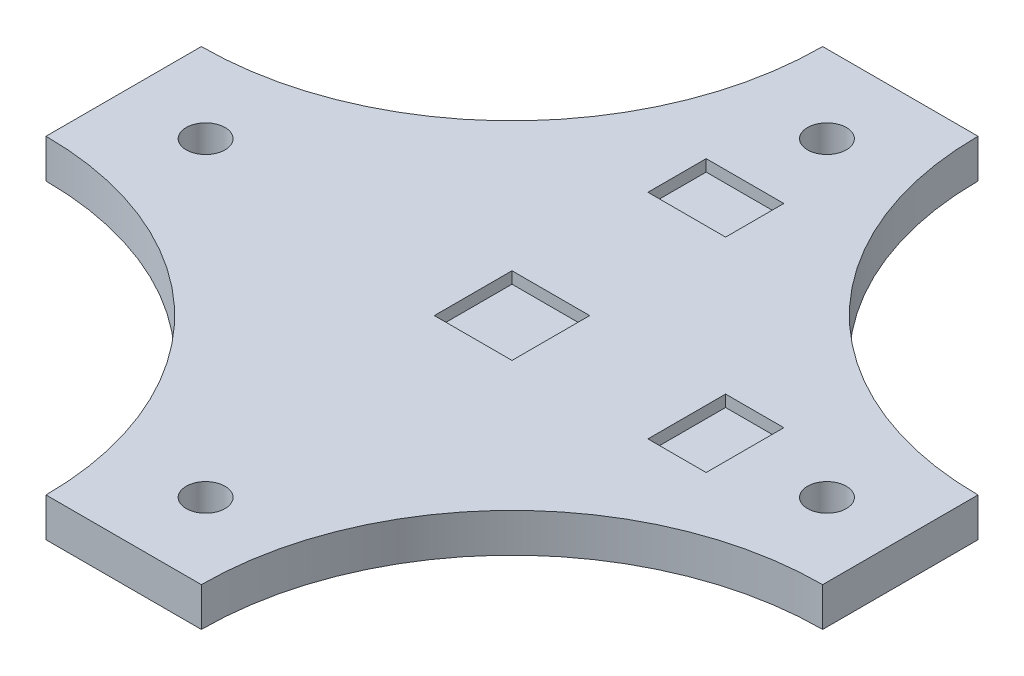
ISO-10303-21;
HEADER;
FILE_DESCRIPTION(('STEP AP214'),'2;1');
FILE_NAME('part.step','',(''),(''),'','','');
FILE_SCHEMA(('AUTOMOTIVE_DESIGN { 1 0 10303 214 1 1 1 1 }'));
ENDSEC;
DATA;
#1=APPLICATION_CONTEXT('core data for automotive mechanical design processes');
#2=APPLICATION_PROTOCOL_DEFINITION('international standard','automotive_design',2000,#1);
#3=PRODUCT_CONTEXT('',#1,'mechanical');
#4=PRODUCT('Part','Part','',(#3));
#5=PRODUCT_RELATED_PRODUCT_CATEGORY('part','',(#4));
#6=PRODUCT_DEFINITION_FORMATION('','',#4);
#7=PRODUCT_DEFINITION_CONTEXT('part definition',#1,'design');
#8=PRODUCT_DEFINITION('design','',#6,#7);
#9=PRODUCT_DEFINITION_SHAPE('','',#8);
#10=(LENGTH_UNIT() NAMED_UNIT(*) SI_UNIT(.MILLI.,.METRE.));
#11=(NAMED_UNIT(*) PLANE_ANGLE_UNIT() SI_UNIT($,.RADIAN.));
#12=(NAMED_UNIT(*) SI_UNIT($,.STERADIAN.) SOLID_ANGLE_UNIT());
#13=UNCERTAINTY_MEASURE_WITH_UNIT(LENGTH_MEASURE(1.E-05),#10,'distance_accuracy_value','');
#14=(GEOMETRIC_REPRESENTATION_CONTEXT(3) GLOBAL_UNCERTAINTY_ASSIGNED_CONTEXT((#13)) GLOBAL_UNIT_ASSIGNED_CONTEXT((#10,
#11,#12)) REPRESENTATION_CONTEXT('',''));
#15=CARTESIAN_POINT('',(0.,0.,0.));
#16=DIRECTION('',(0.,0.,1.));
#17=DIRECTION('',(1.,0.,0.));
#18=AXIS2_PLACEMENT_3D('',#15,#16,#17);
#19=CARTESIAN_POINT('',(100.,10.,-100.));
#20=DIRECTION('',(-1.,0.,0.));
#21=DIRECTION('',(0.,0.,1.));
#22=AXIS2_PLACEMENT_3D('',#19,#20,#21);
#23=PLANE('',#22);
#24=DIRECTION('',(0.,1.,0.));
#25=VECTOR('',#24,1.);
#26=CARTESIAN_POINT('',(100.,0.,20.));
#27=LINE('',#26,#25);
#28=CARTESIAN_POINT('',(100.,0.,20.));
#29=VERTEX_POINT('',#28);
#30=CARTESIAN_POINT('',(100.,10.,20.));
#31=VERTEX_POINT('',#30);
#32=EDGE_CURVE('E318',#29,#31,#27,.T.);
#33=ORIENTED_EDGE('',*,*,#32,.F.);
#34=DIRECTION('',(0.,0.,-1.));
#35=VECTOR('',#34,1.);
#36=CARTESIAN_POINT('',(100.,0.,-100.));
#37=LINE('',#36,#35);
#38=CARTESIAN_POINT('',(100.,0.,-20.));
#39=VERTEX_POINT('',#38);
#40=EDGE_CURVE('E199',#29,#39,#37,.T.);
#41=ORIENTED_EDGE('',*,*,#40,.T.);
#42=DIRECTION('',(0.,1.,0.));
#43=VECTOR('',#42,1.);
#44=CARTESIAN_POINT('',(100.,0.,-20.));
#45=LINE('',#44,#43);
#46=CARTESIAN_POINT('',(100.,10.,-20.));
#47=VERTEX_POINT('',#46);
#48=EDGE_CURVE('E271',#39,#47,#45,.T.);
#49=ORIENTED_EDGE('',*,*,#48,.T.);
#50=DIRECTION('',(0.,0.,-1.));
#51=VECTOR('',#50,1.);
#52=CARTESIAN_POINT('',(100.,10.,-100.));
#53=LINE('',#52,#51);
#54=EDGE_CURVE('E198',#31,#47,#53,.T.);
#55=ORIENTED_EDGE('',*,*,#54,.F.);
#56=EDGE_LOOP('',(#33,#41,#49,#55));
#57=FACE_BOUND('',#56,.T.);
#58=ADVANCED_FACE('F38',(#57),#23,.F.);
#59=CARTESIAN_POINT('',(-100.,10.,-100.));
#60=DIRECTION('',(0.,0.,1.));
#61=DIRECTION('',(1.,0.,0.));
#62=AXIS2_PLACEMENT_3D('',#59,#60,#61);
#63=PLANE('',#62);
#64=DIRECTION('',(0.,1.,0.));
#65=VECTOR('',#64,1.);
#66=CARTESIAN_POINT('',(-20.,0.,-100.));
#67=LINE('',#66,#65);
#68=CARTESIAN_POINT('',(-20.,0.,-100.));
#69=VERTEX_POINT('',#68);
#70=CARTESIAN_POINT('',(-20.,10.,-100.));
#71=VERTEX_POINT('',#70);
#72=EDGE_CURVE('E54',#69,#71,#67,.T.);
#73=ORIENTED_EDGE('',*,*,#72,.T.);
#74=DIRECTION('',(-1.,0.,0.));
#75=VECTOR('',#74,1.);
#76=CARTESIAN_POINT('',(-100.,10.,-100.));
#77=LINE('',#76,#75);
#78=CARTESIAN_POINT('',(20.,10.,-100.));
#79=VERTEX_POINT('',#78);
#80=EDGE_CURVE('E206',#79,#71,#77,.T.);
#81=ORIENTED_EDGE('',*,*,#80,.F.);
#82=DIRECTION('',(0.,1.,0.));
#83=VECTOR('',#82,1.);
#84=CARTESIAN_POINT('',(20.,0.,-100.));
#85=LINE('',#84,#83);
#86=CARTESIAN_POINT('',(20.,0.,-100.));
#87=VERTEX_POINT('',#86);
#88=EDGE_CURVE('E307',#87,#79,#85,.T.);
#89=ORIENTED_EDGE('',*,*,#88,.F.);
#90=DIRECTION('',(-1.,0.,0.));
#91=VECTOR('',#90,1.);
#92=CARTESIAN_POINT('',(-100.,0.,-100.));
#93=LINE('',#92,#91);
#94=EDGE_CURVE('E196',#87,#69,#93,.T.);
#95=ORIENTED_EDGE('',*,*,#94,.T.);
#96=EDGE_LOOP('',(#73,#81,#89,#95));
#97=FACE_BOUND('',#96,.T.);
#98=ADVANCED_FACE('F405',(#97),#63,.F.);
#99=CARTESIAN_POINT('',(-100.,10.,-100.));
#100=DIRECTION('',(1.,0.,0.));
#101=DIRECTION('',(0.,0.,-1.));
#102=AXIS2_PLACEMENT_3D('',#99,#100,#101);
#103=PLANE('',#102);
#104=DIRECTION('',(0.,0.,1.));
#105=VECTOR('',#104,1.);
#106=CARTESIAN_POINT('',(-100.,0.,-100.));
#107=LINE('',#106,#105);
#108=CARTESIAN_POINT('',(-100.,0.,-20.));
#109=VERTEX_POINT('',#108);
#110=CARTESIAN_POINT('',(-100.,0.,20.));
#111=VERTEX_POINT('',#110);
#112=EDGE_CURVE('E188',#109,#111,#107,.T.);
#113=ORIENTED_EDGE('',*,*,#112,.T.);
#114=DIRECTION('',(0.,1.,0.));
#115=VECTOR('',#114,1.);
#116=CARTESIAN_POINT('',(-100.,0.,20.));
#117=LINE('',#116,#115);
#118=CARTESIAN_POINT('',(-100.,10.,20.));
#119=VERTEX_POINT('',#118);
#120=EDGE_CURVE('E62',#111,#119,#117,.T.);
#121=ORIENTED_EDGE('',*,*,#120,.T.);
#122=DIRECTION('',(0.,0.,1.));
#123=VECTOR('',#122,1.);
#124=CARTESIAN_POINT('',(-100.,10.,-100.));
#125=LINE('',#124,#123);
#126=CARTESIAN_POINT('',(-100.,10.,-20.));
#127=VERTEX_POINT('',#126);
#128=EDGE_CURVE('E46',#127,#119,#125,.T.);
#129=ORIENTED_EDGE('',*,*,#128,.F.);
#130=DIRECTION('',(0.,1.,0.));
#131=VECTOR('',#130,1.);
#132=CARTESIAN_POINT('',(-100.,0.,-20.));
#133=LINE('',#132,#131);
#134=EDGE_CURVE('E176',#109,#127,#133,.T.);
#135=ORIENTED_EDGE('',*,*,#134,.F.);
#136=EDGE_LOOP('',(#113,#121,#129,#135));
#137=FACE_BOUND('',#136,.T.);
#138=ADVANCED_FACE('F187',(#137),#103,.F.);
#139=CARTESIAN_POINT('',(-100.,10.,100.));
#140=DIRECTION('',(0.,0.,-1.));
#141=DIRECTION('',(-1.,0.,0.));
#142=AXIS2_PLACEMENT_3D('',#139,#140,#141);
#143=PLANE('',#142);
#144=DIRECTION('',(0.,1.,0.));
#145=VECTOR('',#144,1.);
#146=CARTESIAN_POINT('',(20.,0.,100.));
#147=LINE('',#146,#145);
#148=CARTESIAN_POINT('',(20.,0.,100.));
#149=VERTEX_POINT('',#148);
#150=CARTESIAN_POINT('',(20.,10.,100.));
#151=VERTEX_POINT('',#150);
#152=EDGE_CURVE('E315',#149,#151,#147,.T.);
#153=ORIENTED_EDGE('',*,*,#152,.T.);
#154=DIRECTION('',(1.,0.,0.));
#155=VECTOR('',#154,1.);
#156=CARTESIAN_POINT('',(-100.,10.,100.));
#157=LINE('',#156,#155);
#158=CARTESIAN_POINT('',(-20.,10.,100.));
#159=VERTEX_POINT('',#158);
#160=EDGE_CURVE('E11',#159,#151,#157,.T.);
#161=ORIENTED_EDGE('',*,*,#160,.F.);
#162=DIRECTION('',(0.,1.,0.));
#163=VECTOR('',#162,1.);
#164=CARTESIAN_POINT('',(-20.,0.,100.));
#165=LINE('',#164,#163);
#166=CARTESIAN_POINT('',(-20.,0.,100.));
#167=VERTEX_POINT('',#166);
#168=EDGE_CURVE('E327',#167,#159,#165,.T.);
#169=ORIENTED_EDGE('',*,*,#168,.F.);
#170=DIRECTION('',(1.,0.,0.));
#171=VECTOR('',#170,1.);
#172=CARTESIAN_POINT('',(-100.,0.,100.));
#173=LINE('',#172,#171);
#174=EDGE_CURVE('E41',#167,#149,#173,.T.);
#175=ORIENTED_EDGE('',*,*,#174,.T.);
#176=EDGE_LOOP('',(#153,#161,#169,#175));
#177=FACE_BOUND('',#176,.T.);
#178=ADVANCED_FACE('F370',(#177),#143,.F.);
#179=CARTESIAN_POINT('',(0.,10.,0.));
#180=DIRECTION('',(0.,1.,0.));
#181=DIRECTION('',(0.,0.,1.));
#182=AXIS2_PLACEMENT_3D('',#179,#180,#181);
#183=PLANE('',#182);
#184=CARTESIAN_POINT('',(-78.897440542475,10.,0.));
#185=DIRECTION('',(0.,1.,0.));
#186=DIRECTION('',(0.,0.,1.));
#187=AXIS2_PLACEMENT_3D('',#184,#185,#186);
#188=CIRCLE('',#187,5.);
#189=CARTESIAN_POINT('',(-78.897440542475,10.,5.));
#190=VERTEX_POINT('',#189);
#191=EDGE_CURVE('E352',#190,#190,#188,.T.);
#192=ORIENTED_EDGE('',*,*,#191,.F.);
#193=EDGE_LOOP('',(#192));
#194=FACE_BOUND('',#193,.T.);
#195=CARTESIAN_POINT('',(1.10255945752497,10.,-80.));
#196=DIRECTION('',(0.,1.,0.));
#197=DIRECTION('',(0.,0.,1.));
#198=AXIS2_PLACEMENT_3D('',#195,#196,#197);
#199=CIRCLE('',#198,5.);
#200=CARTESIAN_POINT('',(1.10255945752497,10.,-75.));
#201=VERTEX_POINT('',#200);
#202=EDGE_CURVE('E349',#201,#201,#199,.T.);
#203=ORIENTED_EDGE('',*,*,#202,.F.);
#204=EDGE_LOOP('',(#203));
#205=FACE_BOUND('',#204,.T.);
#206=CARTESIAN_POINT('',(81.102559457525,10.,0.));
#207=DIRECTION('',(0.,1.,0.));
#208=DIRECTION('',(0.,0.,1.));
#209=AXIS2_PLACEMENT_3D('',#206,#207,#208);
#210=CIRCLE('',#209,5.);
#211=CARTESIAN_POINT('',(81.102559457525,10.,4.99999999999999));
#212=VERTEX_POINT('',#211);
#213=EDGE_CURVE('E343',#212,#212,#210,.T.);
#214=ORIENTED_EDGE('',*,*,#213,.F.);
#215=EDGE_LOOP('',(#214));
#216=FACE_BOUND('',#215,.T.);
#217=CARTESIAN_POINT('',(1.10255945752497,10.,80.));
#218=DIRECTION('',(0.,1.,0.));
#219=DIRECTION('',(0.,0.,1.));
#220=AXIS2_PLACEMENT_3D('',#217,#218,#219);
#221=CIRCLE('',#220,5.);
#222=CARTESIAN_POINT('',(1.10255945752497,10.,85.));
#223=VERTEX_POINT('',#222);
#224=EDGE_CURVE('E337',#223,#223,#221,.T.);
#225=ORIENTED_EDGE('',*,*,#224,.F.);
#226=EDGE_LOOP('',(#225));
#227=FACE_BOUND('',#226,.T.);
#228=DIRECTION('',(0.,0.,-1.));
#229=VECTOR('',#228,1.);
#230=CARTESIAN_POINT('',(60.,10.,-10.));
#231=LINE('',#230,#229);
#232=CARTESIAN_POINT('',(60.,10.,9.99999999999998));
#233=VERTEX_POINT('',#232);
#234=CARTESIAN_POINT('',(60.,10.,-10.));
#235=VERTEX_POINT('',#234);
#236=EDGE_CURVE('E257',#233,#235,#231,.T.);
#237=ORIENTED_EDGE('',*,*,#236,.F.);
#238=DIRECTION('',(1.,0.,0.));
#239=VECTOR('',#238,1.);
#240=CARTESIAN_POINT('',(45.,10.,9.99999999999998));
#241=LINE('',#240,#239);
#242=CARTESIAN_POINT('',(45.,10.,9.99999999999998));
#243=VERTEX_POINT('',#242);
#244=EDGE_CURVE('E246',#243,#233,#241,.T.);
#245=ORIENTED_EDGE('',*,*,#244,.F.);
#246=DIRECTION('',(0.,0.,1.));
#247=VECTOR('',#246,1.);
#248=CARTESIAN_POINT('',(45.,10.,-10.));
#249=LINE('',#248,#247);
#250=CARTESIAN_POINT('',(45.,10.,-10.));
#251=VERTEX_POINT('',#250);
#252=EDGE_CURVE('E263',#251,#243,#249,.T.);
#253=ORIENTED_EDGE('',*,*,#252,.F.);
#254=DIRECTION('',(-1.,0.,0.));
#255=VECTOR('',#254,1.);
#256=CARTESIAN_POINT('',(45.,10.,-10.));
#257=LINE('',#256,#255);
#258=EDGE_CURVE('E260',#235,#251,#257,.T.);
#259=ORIENTED_EDGE('',*,*,#258,.F.);
#260=EDGE_LOOP('',(#237,#245,#253,#259));
#261=FACE_BOUND('',#260,.T.);
#262=DIRECTION('',(0.,0.,-1.));
#263=VECTOR('',#262,1.);
#264=CARTESIAN_POINT('',(9.99999999999999,10.,-60.));
#265=LINE('',#264,#263);
#266=CARTESIAN_POINT('',(10.,10.,-45.));
#267=VERTEX_POINT('',#266);
#268=CARTESIAN_POINT('',(9.99999999999999,10.,-60.));
#269=VERTEX_POINT('',#268);
#270=EDGE_CURVE('E232',#267,#269,#265,.T.);
#271=ORIENTED_EDGE('',*,*,#270,.F.);
#272=DIRECTION('',(1.,0.,0.));
#273=VECTOR('',#272,1.);
#274=CARTESIAN_POINT('',(-10.,10.,-45.));
#275=LINE('',#274,#273);
#276=CARTESIAN_POINT('',(-10.,10.,-45.));
#277=VERTEX_POINT('',#276);
#278=EDGE_CURVE('E280',#277,#267,#275,.T.);
#279=ORIENTED_EDGE('',*,*,#278,.F.);
#280=DIRECTION('',(0.,0.,1.));
#281=VECTOR('',#280,1.);
#282=CARTESIAN_POINT('',(-10.,10.,-60.));
#283=LINE('',#282,#281);
#284=CARTESIAN_POINT('',(-10.,10.,-60.));
#285=VERTEX_POINT('',#284);
#286=EDGE_CURVE('E295',#285,#277,#283,.T.);
#287=ORIENTED_EDGE('',*,*,#286,.F.);
#288=DIRECTION('',(-1.,0.,0.));
#289=VECTOR('',#288,1.);
#290=CARTESIAN_POINT('',(-10.,10.,-60.));
#291=LINE('',#290,#289);
#292=EDGE_CURVE('E292',#269,#285,#291,.T.);
#293=ORIENTED_EDGE('',*,*,#292,.F.);
#294=EDGE_LOOP('',(#271,#279,#287,#293));
#295=FACE_BOUND('',#294,.T.);
#296=DIRECTION('',(0.,0.,-1.));
#297=VECTOR('',#296,1.);
#298=CARTESIAN_POINT('',(10.,10.,-10.));
#299=LINE('',#298,#297);
#300=CARTESIAN_POINT('',(10.,10.,10.));
#301=VERTEX_POINT('',#300);
#302=CARTESIAN_POINT('',(10.,10.,-10.));
#303=VERTEX_POINT('',#302);
#304=EDGE_CURVE('E230',#301,#303,#299,.T.);
#305=ORIENTED_EDGE('',*,*,#304,.F.);
#306=DIRECTION('',(1.,0.,0.));
#307=VECTOR('',#306,1.);
#308=CARTESIAN_POINT('',(-10.,10.,10.));
#309=LINE('',#308,#307);
#310=CARTESIAN_POINT('',(-10.,10.,10.));
#311=VERTEX_POINT('',#310);
#312=EDGE_CURVE('E220',#311,#301,#309,.T.);
#313=ORIENTED_EDGE('',*,*,#312,.F.);
#314=DIRECTION('',(0.,0.,1.));
#315=VECTOR('',#314,1.);
#316=CARTESIAN_POINT('',(-10.,10.,-10.));
#317=LINE('',#316,#315);
#318=CARTESIAN_POINT('',(-10.,10.,-10.));
#319=VERTEX_POINT('',#318);
#320=EDGE_CURVE('E224',#319,#311,#317,.T.);
#321=ORIENTED_EDGE('',*,*,#320,.F.);
#322=DIRECTION('',(-1.,0.,0.));
#323=VECTOR('',#322,1.);
#324=CARTESIAN_POINT('',(-10.,10.,-10.));
#325=LINE('',#324,#323);
#326=EDGE_CURVE('E227',#303,#319,#325,.T.);
#327=ORIENTED_EDGE('',*,*,#326,.F.);
#328=EDGE_LOOP('',(#305,#313,#321,#327));
#329=FACE_BOUND('',#328,.T.);
#330=ORIENTED_EDGE('',*,*,#160,.T.);
#331=CARTESIAN_POINT('',(100.,10.,100.));
#332=DIRECTION('',(0.,1.,0.));
#333=DIRECTION('',(0.,0.,1.));
#334=AXIS2_PLACEMENT_3D('',#331,#332,#333);
#335=CIRCLE('',#334,80.);
#336=EDGE_CURVE('E322',#151,#31,#335,.F.);
#337=ORIENTED_EDGE('',*,*,#336,.T.);
#338=ORIENTED_EDGE('',*,*,#54,.T.);
#339=CARTESIAN_POINT('',(100.,10.,-100.));
#340=DIRECTION('',(0.,1.,0.));
#341=DIRECTION('',(0.,0.,1.));
#342=AXIS2_PLACEMENT_3D('',#339,#340,#341);
#343=CIRCLE('',#342,80.);
#344=EDGE_CURVE('E190',#79,#47,#343,.T.);
#345=ORIENTED_EDGE('',*,*,#344,.F.);
#346=ORIENTED_EDGE('',*,*,#80,.T.);
#347=CARTESIAN_POINT('',(-100.,10.,-100.));
#348=DIRECTION('',(0.,1.,0.));
#349=DIRECTION('',(0.,0.,1.));
#350=AXIS2_PLACEMENT_3D('',#347,#348,#349);
#351=CIRCLE('',#350,80.);
#352=EDGE_CURVE('E182',#71,#127,#351,.F.);
#353=ORIENTED_EDGE('',*,*,#352,.T.);
#354=ORIENTED_EDGE('',*,*,#128,.T.);
#355=CARTESIAN_POINT('',(-100.,10.,100.));
#356=DIRECTION('',(0.,1.,0.));
#357=DIRECTION('',(0.,0.,1.));
#358=AXIS2_PLACEMENT_3D('',#355,#356,#357);
#359=CIRCLE('',#358,80.);
#360=EDGE_CURVE('E321',#159,#119,#359,.T.);
#361=ORIENTED_EDGE('',*,*,#360,.F.);
#362=EDGE_LOOP('',(#330,#337,#338,#345,#346,#353,#354,#361));
#363=FACE_BOUND('',#362,.T.);
#364=ADVANCED_FACE('F367',(#194,#205,#216,#227,#261,#295,#329,#363),#183,.T.);
#365=CARTESIAN_POINT('',(0.,0.,0.));
#366=DIRECTION('',(0.,1.,0.));
#367=DIRECTION('',(0.,0.,1.));
#368=AXIS2_PLACEMENT_3D('',#365,#366,#367);
#369=PLANE('',#368);
#370=CARTESIAN_POINT('',(-78.897440542475,0.,0.));
#371=DIRECTION('',(0.,1.,0.));
#372=DIRECTION('',(0.,0.,1.));
#373=AXIS2_PLACEMENT_3D('',#370,#371,#372);
#374=CIRCLE('',#373,5.);
#375=CARTESIAN_POINT('',(-78.897440542475,0.,5.));
#376=VERTEX_POINT('',#375);
#377=EDGE_CURVE('E325',#376,#376,#374,.T.);
#378=ORIENTED_EDGE('',*,*,#377,.T.);
#379=EDGE_LOOP('',(#378));
#380=FACE_BOUND('',#379,.T.);
#381=CARTESIAN_POINT('',(1.10255945752497,0.,-80.));
#382=DIRECTION('',(0.,1.,0.));
#383=DIRECTION('',(0.,0.,1.));
#384=AXIS2_PLACEMENT_3D('',#381,#382,#383);
#385=CIRCLE('',#384,5.);
#386=CARTESIAN_POINT('',(1.10255945752497,0.,-75.));
#387=VERTEX_POINT('',#386);
#388=EDGE_CURVE('E346',#387,#387,#385,.T.);
#389=ORIENTED_EDGE('',*,*,#388,.T.);
#390=EDGE_LOOP('',(#389));
#391=FACE_BOUND('',#390,.T.);
#392=CARTESIAN_POINT('',(81.102559457525,0.,0.));
#393=DIRECTION('',(0.,1.,0.));
#394=DIRECTION('',(0.,0.,1.));
#395=AXIS2_PLACEMENT_3D('',#392,#393,#394);
#396=CIRCLE('',#395,5.);
#397=CARTESIAN_POINT('',(81.102559457525,0.,4.99999999999999));
#398=VERTEX_POINT('',#397);
#399=EDGE_CURVE('E340',#398,#398,#396,.T.);
#400=ORIENTED_EDGE('',*,*,#399,.T.);
#401=EDGE_LOOP('',(#400));
#402=FACE_BOUND('',#401,.T.);
#403=CARTESIAN_POINT('',(1.10255945752497,0.,80.));
#404=DIRECTION('',(0.,1.,0.));
#405=DIRECTION('',(0.,0.,1.));
#406=AXIS2_PLACEMENT_3D('',#403,#404,#405);
#407=CIRCLE('',#406,5.);
#408=CARTESIAN_POINT('',(1.10255945752497,0.,85.));
#409=VERTEX_POINT('',#408);
#410=EDGE_CURVE('E334',#409,#409,#407,.T.);
#411=ORIENTED_EDGE('',*,*,#410,.T.);
#412=EDGE_LOOP('',(#411));
#413=FACE_BOUND('',#412,.T.);
#414=CARTESIAN_POINT('',(100.,0.,100.));
#415=DIRECTION('',(0.,1.,0.));
#416=DIRECTION('',(0.,0.,1.));
#417=AXIS2_PLACEMENT_3D('',#414,#415,#416);
#418=CIRCLE('',#417,80.);
#419=EDGE_CURVE('E319',#149,#29,#418,.F.);
#420=ORIENTED_EDGE('',*,*,#419,.F.);
#421=ORIENTED_EDGE('',*,*,#174,.F.);
#422=CARTESIAN_POINT('',(-100.,0.,100.));
#423=DIRECTION('',(0.,1.,0.));
#424=DIRECTION('',(0.,0.,1.));
#425=AXIS2_PLACEMENT_3D('',#422,#423,#424);
#426=CIRCLE('',#425,80.);
#427=EDGE_CURVE('E195',#167,#111,#426,.T.);
#428=ORIENTED_EDGE('',*,*,#427,.T.);
#429=ORIENTED_EDGE('',*,*,#112,.F.);
#430=CARTESIAN_POINT('',(-100.,0.,-100.));
#431=DIRECTION('',(0.,1.,0.));
#432=DIRECTION('',(0.,0.,1.));
#433=AXIS2_PLACEMENT_3D('',#430,#431,#432);
#434=CIRCLE('',#433,80.);
#435=EDGE_CURVE('E173',#69,#109,#434,.F.);
#436=ORIENTED_EDGE('',*,*,#435,.F.);
#437=ORIENTED_EDGE('',*,*,#94,.F.);
#438=CARTESIAN_POINT('',(100.,0.,-100.));
#439=DIRECTION('',(0.,1.,0.));
#440=DIRECTION('',(0.,0.,1.));
#441=AXIS2_PLACEMENT_3D('',#438,#439,#440);
#442=CIRCLE('',#441,80.);
#443=EDGE_CURVE('E309',#87,#39,#442,.T.);
#444=ORIENTED_EDGE('',*,*,#443,.T.);
#445=ORIENTED_EDGE('',*,*,#40,.F.);
#446=EDGE_LOOP('',(#420,#421,#428,#429,#436,#437,#444,#445));
#447=FACE_BOUND('',#446,.T.);
#448=ADVANCED_FACE('F193',(#380,#391,#402,#413,#447),#369,.F.);
#449=CARTESIAN_POINT('',(10.,7.,-10.));
#450=DIRECTION('',(1.,0.,0.));
#451=DIRECTION('',(0.,0.,-1.));
#452=AXIS2_PLACEMENT_3D('',#449,#450,#451);
#453=PLANE('',#452);
#454=ORIENTED_EDGE('',*,*,#304,.T.);
#455=DIRECTION('',(0.,1.,0.));
#456=VECTOR('',#455,1.);
#457=CARTESIAN_POINT('',(10.,7.,-10.));
#458=LINE('',#457,#456);
#459=CARTESIAN_POINT('',(10.,7.,-10.));
#460=VERTEX_POINT('',#459);
#461=EDGE_CURVE('E211',#460,#303,#458,.T.);
#462=ORIENTED_EDGE('',*,*,#461,.F.);
#463=DIRECTION('',(0.,0.,-1.));
#464=VECTOR('',#463,1.);
#465=CARTESIAN_POINT('',(10.,7.,-10.));
#466=LINE('',#465,#464);
#467=CARTESIAN_POINT('',(10.,7.,10.));
#468=VERTEX_POINT('',#467);
#469=EDGE_CURVE('E223',#468,#460,#466,.T.);
#470=ORIENTED_EDGE('',*,*,#469,.F.);
#471=DIRECTION('',(0.,1.,0.));
#472=VECTOR('',#471,1.);
#473=CARTESIAN_POINT('',(10.,7.,10.));
#474=LINE('',#473,#472);
#475=EDGE_CURVE('E203',#468,#301,#474,.T.);
#476=ORIENTED_EDGE('',*,*,#475,.T.);
#477=EDGE_LOOP('',(#454,#462,#470,#476));
#478=FACE_BOUND('',#477,.T.);
#479=ADVANCED_FACE('F433',(#478),#453,.F.);
#480=CARTESIAN_POINT('',(-10.,7.,10.));
#481=DIRECTION('',(0.,0.,1.));
#482=DIRECTION('',(1.,0.,0.));
#483=AXIS2_PLACEMENT_3D('',#480,#481,#482);
#484=PLANE('',#483);
#485=ORIENTED_EDGE('',*,*,#312,.T.);
#486=ORIENTED_EDGE('',*,*,#475,.F.);
#487=DIRECTION('',(1.,0.,0.));
#488=VECTOR('',#487,1.);
#489=CARTESIAN_POINT('',(-10.,7.,10.));
#490=LINE('',#489,#488);
#491=CARTESIAN_POINT('',(-10.,7.,10.));
#492=VERTEX_POINT('',#491);
#493=EDGE_CURVE('E215',#492,#468,#490,.T.);
#494=ORIENTED_EDGE('',*,*,#493,.F.);
#495=DIRECTION('',(0.,1.,0.));
#496=VECTOR('',#495,1.);
#497=CARTESIAN_POINT('',(-10.,7.,10.));
#498=LINE('',#497,#496);
#499=EDGE_CURVE('E217',#492,#311,#498,.T.);
#500=ORIENTED_EDGE('',*,*,#499,.T.);
#501=EDGE_LOOP('',(#485,#486,#494,#500));
#502=FACE_BOUND('',#501,.T.);
#503=ADVANCED_FACE('F437',(#502),#484,.F.);
#504=CARTESIAN_POINT('',(-10.,7.,-10.));
#505=DIRECTION('',(-1.,0.,0.));
#506=DIRECTION('',(0.,0.,1.));
#507=AXIS2_PLACEMENT_3D('',#504,#505,#506);
#508=PLANE('',#507);
#509=ORIENTED_EDGE('',*,*,#320,.T.);
#510=ORIENTED_EDGE('',*,*,#499,.F.);
#511=DIRECTION('',(0.,0.,1.));
#512=VECTOR('',#511,1.);
#513=CARTESIAN_POINT('',(-10.,7.,-10.));
#514=LINE('',#513,#512);
#515=CARTESIAN_POINT('',(-10.,7.,-10.));
#516=VERTEX_POINT('',#515);
#517=EDGE_CURVE('E235',#516,#492,#514,.T.);
#518=ORIENTED_EDGE('',*,*,#517,.F.);
#519=DIRECTION('',(0.,1.,0.));
#520=VECTOR('',#519,1.);
#521=CARTESIAN_POINT('',(-10.,7.,-10.));
#522=LINE('',#521,#520);
#523=EDGE_CURVE('E214',#516,#319,#522,.T.);
#524=ORIENTED_EDGE('',*,*,#523,.T.);
#525=EDGE_LOOP('',(#509,#510,#518,#524));
#526=FACE_BOUND('',#525,.T.);
#527=ADVANCED_FACE('F443',(#526),#508,.F.);
#528=CARTESIAN_POINT('',(-10.,7.,-10.));
#529=DIRECTION('',(0.,0.,-1.));
#530=DIRECTION('',(-1.,0.,0.));
#531=AXIS2_PLACEMENT_3D('',#528,#529,#530);
#532=PLANE('',#531);
#533=ORIENTED_EDGE('',*,*,#326,.T.);
#534=ORIENTED_EDGE('',*,*,#523,.F.);
#535=DIRECTION('',(-1.,0.,0.));
#536=VECTOR('',#535,1.);
#537=CARTESIAN_POINT('',(-10.,7.,-10.));
#538=LINE('',#537,#536);
#539=EDGE_CURVE('E238',#460,#516,#538,.T.);
#540=ORIENTED_EDGE('',*,*,#539,.F.);
#541=ORIENTED_EDGE('',*,*,#461,.T.);
#542=EDGE_LOOP('',(#533,#534,#540,#541));
#543=FACE_BOUND('',#542,.T.);
#544=ADVANCED_FACE('F439',(#543),#532,.F.);
#545=CARTESIAN_POINT('',(0.,7.,0.));
#546=DIRECTION('',(0.,1.,0.));
#547=DIRECTION('',(0.,0.,1.));
#548=AXIS2_PLACEMENT_3D('',#545,#546,#547);
#549=PLANE('',#548);
#550=ORIENTED_EDGE('',*,*,#469,.T.);
#551=ORIENTED_EDGE('',*,*,#539,.T.);
#552=ORIENTED_EDGE('',*,*,#517,.T.);
#553=ORIENTED_EDGE('',*,*,#493,.T.);
#554=EDGE_LOOP('',(#550,#551,#552,#553));
#555=FACE_BOUND('',#554,.T.);
#556=ADVANCED_FACE('F442',(#555),#549,.T.);
#557=CARTESIAN_POINT('',(9.99999999999999,7.,-60.));
#558=DIRECTION('',(1.,0.,0.));
#559=DIRECTION('',(0.,0.,-1.));
#560=AXIS2_PLACEMENT_3D('',#557,#558,#559);
#561=PLANE('',#560);
#562=ORIENTED_EDGE('',*,*,#270,.T.);
#563=DIRECTION('',(0.,1.,0.));
#564=VECTOR('',#563,1.);
#565=CARTESIAN_POINT('',(9.99999999999999,7.,-60.));
#566=LINE('',#565,#564);
#567=CARTESIAN_POINT('',(9.99999999999999,7.,-60.));
#568=VERTEX_POINT('',#567);
#569=EDGE_CURVE('E290',#568,#269,#566,.T.);
#570=ORIENTED_EDGE('',*,*,#569,.F.);
#571=DIRECTION('',(0.,0.,-1.));
#572=VECTOR('',#571,1.);
#573=CARTESIAN_POINT('',(9.99999999999999,7.,-60.));
#574=LINE('',#573,#572);
#575=CARTESIAN_POINT('',(10.,7.,-45.));
#576=VERTEX_POINT('',#575);
#577=EDGE_CURVE('E277',#576,#568,#574,.T.);
#578=ORIENTED_EDGE('',*,*,#577,.F.);
#579=DIRECTION('',(0.,1.,0.));
#580=VECTOR('',#579,1.);
#581=CARTESIAN_POINT('',(10.,7.,-45.));
#582=LINE('',#581,#580);
#583=EDGE_CURVE('E259',#576,#267,#582,.T.);
#584=ORIENTED_EDGE('',*,*,#583,.T.);
#585=EDGE_LOOP('',(#562,#570,#578,#584));
#586=FACE_BOUND('',#585,.T.);
#587=ADVANCED_FACE('F452',(#586),#561,.F.);
#588=CARTESIAN_POINT('',(-10.,7.,-45.));
#589=DIRECTION('',(0.,0.,1.));
#590=DIRECTION('',(1.,0.,0.));
#591=AXIS2_PLACEMENT_3D('',#588,#589,#590);
#592=PLANE('',#591);
#593=ORIENTED_EDGE('',*,*,#278,.T.);
#594=ORIENTED_EDGE('',*,*,#583,.F.);
#595=DIRECTION('',(1.,0.,0.));
#596=VECTOR('',#595,1.);
#597=CARTESIAN_POINT('',(-10.,7.,-45.));
#598=LINE('',#597,#596);
#599=CARTESIAN_POINT('',(-10.,7.,-45.));
#600=VERTEX_POINT('',#599);
#601=EDGE_CURVE('E287',#600,#576,#598,.T.);
#602=ORIENTED_EDGE('',*,*,#601,.F.);
#603=DIRECTION('',(0.,1.,0.));
#604=VECTOR('',#603,1.);
#605=CARTESIAN_POINT('',(-10.,7.,-45.));
#606=LINE('',#605,#604);
#607=EDGE_CURVE('E301',#600,#277,#606,.T.);
#608=ORIENTED_EDGE('',*,*,#607,.T.);
#609=EDGE_LOOP('',(#593,#594,#602,#608));
#610=FACE_BOUND('',#609,.T.);
#611=ADVANCED_FACE('F475',(#610),#592,.F.);
#612=CARTESIAN_POINT('',(-10.,7.,-60.));
#613=DIRECTION('',(-1.,0.,0.));
#614=DIRECTION('',(0.,0.,1.));
#615=AXIS2_PLACEMENT_3D('',#612,#613,#614);
#616=PLANE('',#615);
#617=ORIENTED_EDGE('',*,*,#286,.T.);
#618=ORIENTED_EDGE('',*,*,#607,.F.);
#619=DIRECTION('',(0.,0.,1.));
#620=VECTOR('',#619,1.);
#621=CARTESIAN_POINT('',(-10.,7.,-60.));
#622=LINE('',#621,#620);
#623=CARTESIAN_POINT('',(-10.,7.,-60.));
#624=VERTEX_POINT('',#623);
#625=EDGE_CURVE('E284',#624,#600,#622,.T.);
#626=ORIENTED_EDGE('',*,*,#625,.F.);
#627=DIRECTION('',(0.,1.,0.));
#628=VECTOR('',#627,1.);
#629=CARTESIAN_POINT('',(-10.,7.,-60.));
#630=LINE('',#629,#628);
#631=EDGE_CURVE('E303',#624,#285,#630,.T.);
#632=ORIENTED_EDGE('',*,*,#631,.T.);
#633=EDGE_LOOP('',(#617,#618,#626,#632));
#634=FACE_BOUND('',#633,.T.);
#635=ADVANCED_FACE('F478',(#634),#616,.F.);
#636=CARTESIAN_POINT('',(-10.,7.,-60.));
#637=DIRECTION('',(0.,0.,-1.));
#638=DIRECTION('',(-1.,0.,0.));
#639=AXIS2_PLACEMENT_3D('',#636,#637,#638);
#640=PLANE('',#639);
#641=ORIENTED_EDGE('',*,*,#292,.T.);
#642=ORIENTED_EDGE('',*,*,#631,.F.);
#643=DIRECTION('',(-1.,0.,0.));
#644=VECTOR('',#643,1.);
#645=CARTESIAN_POINT('',(-10.,7.,-60.));
#646=LINE('',#645,#644);
#647=EDGE_CURVE('E281',#568,#624,#646,.T.);
#648=ORIENTED_EDGE('',*,*,#647,.F.);
#649=ORIENTED_EDGE('',*,*,#569,.T.);
#650=EDGE_LOOP('',(#641,#642,#648,#649));
#651=FACE_BOUND('',#650,.T.);
#652=ADVANCED_FACE('F473',(#651),#640,.F.);
#653=CARTESIAN_POINT('',(0.,7.,0.));
#654=DIRECTION('',(0.,1.,0.));
#655=DIRECTION('',(0.,0.,1.));
#656=AXIS2_PLACEMENT_3D('',#653,#654,#655);
#657=PLANE('',#656);
#658=ORIENTED_EDGE('',*,*,#577,.T.);
#659=ORIENTED_EDGE('',*,*,#647,.T.);
#660=ORIENTED_EDGE('',*,*,#625,.T.);
#661=ORIENTED_EDGE('',*,*,#601,.T.);
#662=EDGE_LOOP('',(#658,#659,#660,#661));
#663=FACE_BOUND('',#662,.T.);
#664=ADVANCED_FACE('F469',(#663),#657,.T.);
#665=CARTESIAN_POINT('',(60.,7.,-10.));
#666=DIRECTION('',(1.,0.,0.));
#667=DIRECTION('',(0.,0.,-1.));
#668=AXIS2_PLACEMENT_3D('',#665,#666,#667);
#669=PLANE('',#668);
#670=ORIENTED_EDGE('',*,*,#236,.T.);
#671=DIRECTION('',(0.,1.,0.));
#672=VECTOR('',#671,1.);
#673=CARTESIAN_POINT('',(60.,7.,-10.));
#674=LINE('',#673,#672);
#675=CARTESIAN_POINT('',(60.,7.,-10.));
#676=VERTEX_POINT('',#675);
#677=EDGE_CURVE('E256',#676,#235,#674,.T.);
#678=ORIENTED_EDGE('',*,*,#677,.F.);
#679=DIRECTION('',(0.,0.,-1.));
#680=VECTOR('',#679,1.);
#681=CARTESIAN_POINT('',(60.,7.,-10.));
#682=LINE('',#681,#680);
#683=CARTESIAN_POINT('',(60.,7.,9.99999999999998));
#684=VERTEX_POINT('',#683);
#685=EDGE_CURVE('E243',#684,#676,#682,.T.);
#686=ORIENTED_EDGE('',*,*,#685,.F.);
#687=DIRECTION('',(0.,1.,0.));
#688=VECTOR('',#687,1.);
#689=CARTESIAN_POINT('',(60.,7.,9.99999999999998));
#690=LINE('',#689,#688);
#691=EDGE_CURVE('E268',#684,#233,#690,.T.);
#692=ORIENTED_EDGE('',*,*,#691,.T.);
#693=EDGE_LOOP('',(#670,#678,#686,#692));
#694=FACE_BOUND('',#693,.T.);
#695=ADVANCED_FACE('F459',(#694),#669,.F.);
#696=CARTESIAN_POINT('',(45.,7.,9.99999999999998));
#697=DIRECTION('',(0.,0.,1.));
#698=DIRECTION('',(1.,0.,0.));
#699=AXIS2_PLACEMENT_3D('',#696,#697,#698);
#700=PLANE('',#699);
#701=ORIENTED_EDGE('',*,*,#244,.T.);
#702=ORIENTED_EDGE('',*,*,#691,.F.);
#703=DIRECTION('',(1.,0.,0.));
#704=VECTOR('',#703,1.);
#705=CARTESIAN_POINT('',(45.,7.,9.99999999999998));
#706=LINE('',#705,#704);
#707=CARTESIAN_POINT('',(45.,7.,9.99999999999998));
#708=VERTEX_POINT('',#707);
#709=EDGE_CURVE('E253',#708,#684,#706,.T.);
#710=ORIENTED_EDGE('',*,*,#709,.F.);
#711=DIRECTION('',(0.,1.,0.));
#712=VECTOR('',#711,1.);
#713=CARTESIAN_POINT('',(45.,7.,9.99999999999998));
#714=LINE('',#713,#712);
#715=EDGE_CURVE('E270',#708,#243,#714,.T.);
#716=ORIENTED_EDGE('',*,*,#715,.T.);
#717=EDGE_LOOP('',(#701,#702,#710,#716));
#718=FACE_BOUND('',#717,.T.);
#719=ADVANCED_FACE('F455',(#718),#700,.F.);
#720=CARTESIAN_POINT('',(45.,7.,-10.));
#721=DIRECTION('',(-1.,0.,0.));
#722=DIRECTION('',(0.,0.,1.));
#723=AXIS2_PLACEMENT_3D('',#720,#721,#722);
#724=PLANE('',#723);
#725=ORIENTED_EDGE('',*,*,#252,.T.);
#726=ORIENTED_EDGE('',*,*,#715,.F.);
#727=DIRECTION('',(0.,0.,1.));
#728=VECTOR('',#727,1.);
#729=CARTESIAN_POINT('',(45.,7.,-10.));
#730=LINE('',#729,#728);
#731=CARTESIAN_POINT('',(45.,7.,-10.));
#732=VERTEX_POINT('',#731);
#733=EDGE_CURVE('E250',#732,#708,#730,.T.);
#734=ORIENTED_EDGE('',*,*,#733,.F.);
#735=DIRECTION('',(0.,1.,0.));
#736=VECTOR('',#735,1.);
#737=CARTESIAN_POINT('',(45.,7.,-10.));
#738=LINE('',#737,#736);
#739=EDGE_CURVE('E273',#732,#251,#738,.T.);
#740=ORIENTED_EDGE('',*,*,#739,.T.);
#741=EDGE_LOOP('',(#725,#726,#734,#740));
#742=FACE_BOUND('',#741,.T.);
#743=ADVANCED_FACE('F458',(#742),#724,.F.);
#744=CARTESIAN_POINT('',(45.,7.,-10.));
#745=DIRECTION('',(0.,0.,-1.));
#746=DIRECTION('',(-1.,0.,0.));
#747=AXIS2_PLACEMENT_3D('',#744,#745,#746);
#748=PLANE('',#747);
#749=ORIENTED_EDGE('',*,*,#258,.T.);
#750=ORIENTED_EDGE('',*,*,#739,.F.);
#751=DIRECTION('',(-1.,0.,0.));
#752=VECTOR('',#751,1.);
#753=CARTESIAN_POINT('',(45.,7.,-10.));
#754=LINE('',#753,#752);
#755=EDGE_CURVE('E247',#676,#732,#754,.T.);
#756=ORIENTED_EDGE('',*,*,#755,.F.);
#757=ORIENTED_EDGE('',*,*,#677,.T.);
#758=EDGE_LOOP('',(#749,#750,#756,#757));
#759=FACE_BOUND('',#758,.T.);
#760=ADVANCED_FACE('F417',(#759),#748,.F.);
#761=CARTESIAN_POINT('',(0.,7.,0.));
#762=DIRECTION('',(0.,1.,0.));
#763=DIRECTION('',(0.,0.,1.));
#764=AXIS2_PLACEMENT_3D('',#761,#762,#763);
#765=PLANE('',#764);
#766=ORIENTED_EDGE('',*,*,#685,.T.);
#767=ORIENTED_EDGE('',*,*,#755,.T.);
#768=ORIENTED_EDGE('',*,*,#733,.T.);
#769=ORIENTED_EDGE('',*,*,#709,.T.);
#770=EDGE_LOOP('',(#766,#767,#768,#769));
#771=FACE_BOUND('',#770,.T.);
#772=ADVANCED_FACE('F408',(#771),#765,.T.);
#773=CARTESIAN_POINT('',(100.,0.,-100.));
#774=DIRECTION('',(0.,1.,0.));
#775=DIRECTION('',(0.,0.,1.));
#776=AXIS2_PLACEMENT_3D('',#773,#774,#775);
#777=CYLINDRICAL_SURFACE('',#776,80.);
#778=ORIENTED_EDGE('',*,*,#344,.T.);
#779=ORIENTED_EDGE('',*,*,#48,.F.);
#780=ORIENTED_EDGE('',*,*,#443,.F.);
#781=ORIENTED_EDGE('',*,*,#88,.T.);
#782=EDGE_LOOP('',(#778,#779,#780,#781));
#783=FACE_BOUND('',#782,.T.);
#784=ADVANCED_FACE('F406',(#783),#777,.F.);
#785=CARTESIAN_POINT('',(-100.,0.,-100.));
#786=DIRECTION('',(0.,1.,0.));
#787=DIRECTION('',(0.,0.,1.));
#788=AXIS2_PLACEMENT_3D('',#785,#786,#787);
#789=CYLINDRICAL_SURFACE('',#788,80.);
#790=ORIENTED_EDGE('',*,*,#352,.F.);
#791=ORIENTED_EDGE('',*,*,#72,.F.);
#792=ORIENTED_EDGE('',*,*,#435,.T.);
#793=ORIENTED_EDGE('',*,*,#134,.T.);
#794=EDGE_LOOP('',(#790,#791,#792,#793));
#795=FACE_BOUND('',#794,.T.);
#796=ADVANCED_FACE('F175',(#795),#789,.F.);
#797=CARTESIAN_POINT('',(-100.,0.,100.));
#798=DIRECTION('',(0.,1.,0.));
#799=DIRECTION('',(0.,0.,1.));
#800=AXIS2_PLACEMENT_3D('',#797,#798,#799);
#801=CYLINDRICAL_SURFACE('',#800,80.);
#802=ORIENTED_EDGE('',*,*,#360,.T.);
#803=ORIENTED_EDGE('',*,*,#120,.F.);
#804=ORIENTED_EDGE('',*,*,#427,.F.);
#805=ORIENTED_EDGE('',*,*,#168,.T.);
#806=EDGE_LOOP('',(#802,#803,#804,#805));
#807=FACE_BOUND('',#806,.T.);
#808=ADVANCED_FACE('F414',(#807),#801,.F.);
#809=CARTESIAN_POINT('',(100.,0.,100.));
#810=DIRECTION('',(0.,1.,0.));
#811=DIRECTION('',(0.,0.,1.));
#812=AXIS2_PLACEMENT_3D('',#809,#810,#811);
#813=CYLINDRICAL_SURFACE('',#812,80.);
#814=ORIENTED_EDGE('',*,*,#336,.F.);
#815=ORIENTED_EDGE('',*,*,#152,.F.);
#816=ORIENTED_EDGE('',*,*,#419,.T.);
#817=ORIENTED_EDGE('',*,*,#32,.T.);
#818=EDGE_LOOP('',(#814,#815,#816,#817));
#819=FACE_BOUND('',#818,.T.);
#820=ADVANCED_FACE('F396',(#819),#813,.F.);
#821=CARTESIAN_POINT('',(1.10255945752497,0.,80.));
#822=DIRECTION('',(0.,1.,0.));
#823=DIRECTION('',(0.,0.,1.));
#824=AXIS2_PLACEMENT_3D('',#821,#822,#823);
#825=CYLINDRICAL_SURFACE('',#824,5.);
#826=ORIENTED_EDGE('',*,*,#410,.F.);
#827=EDGE_LOOP('',(#826));
#828=FACE_BOUND('',#827,.T.);
#829=ORIENTED_EDGE('',*,*,#224,.T.);
#830=EDGE_LOOP('',(#829));
#831=FACE_BOUND('',#830,.T.);
#832=ADVANCED_FACE('F600',(#828,#831),#825,.F.);
#833=CARTESIAN_POINT('',(81.102559457525,0.,0.));
#834=DIRECTION('',(0.,1.,0.));
#835=DIRECTION('',(0.,0.,1.));
#836=AXIS2_PLACEMENT_3D('',#833,#834,#835);
#837=CYLINDRICAL_SURFACE('',#836,5.);
#838=ORIENTED_EDGE('',*,*,#399,.F.);
#839=EDGE_LOOP('',(#838));
#840=FACE_BOUND('',#839,.T.);
#841=ORIENTED_EDGE('',*,*,#213,.T.);
#842=EDGE_LOOP('',(#841));
#843=FACE_BOUND('',#842,.T.);
#844=ADVANCED_FACE('F607',(#840,#843),#837,.F.);
#845=CARTESIAN_POINT('',(1.10255945752497,0.,-80.));
#846=DIRECTION('',(0.,1.,0.));
#847=DIRECTION('',(0.,0.,1.));
#848=AXIS2_PLACEMENT_3D('',#845,#846,#847);
#849=CYLINDRICAL_SURFACE('',#848,5.);
#850=ORIENTED_EDGE('',*,*,#388,.F.);
#851=EDGE_LOOP('',(#850));
#852=FACE_BOUND('',#851,.T.);
#853=ORIENTED_EDGE('',*,*,#202,.T.);
#854=EDGE_LOOP('',(#853));
#855=FACE_BOUND('',#854,.T.);
#856=ADVANCED_FACE('F363',(#852,#855),#849,.F.);
#857=CARTESIAN_POINT('',(-78.897440542475,0.,0.));
#858=DIRECTION('',(0.,1.,0.));
#859=DIRECTION('',(0.,0.,1.));
#860=AXIS2_PLACEMENT_3D('',#857,#858,#859);
#861=CYLINDRICAL_SURFACE('',#860,5.);
#862=ORIENTED_EDGE('',*,*,#377,.F.);
#863=EDGE_LOOP('',(#862));
#864=FACE_BOUND('',#863,.T.);
#865=ORIENTED_EDGE('',*,*,#191,.T.);
#866=EDGE_LOOP('',(#865));
#867=FACE_BOUND('',#866,.T.);
#868=ADVANCED_FACE('F360',(#864,#867),#861,.F.);
#869=CLOSED_SHELL('',(#58,#98,#138,#178,#364,#448,#479,#503,#527,#544,#556,#587,#611,#635,#652,
#664,#695,#719,#743,#760,#772,#784,#796,#808,#820,#832,#844,#856,#868));
#870=MANIFOLD_SOLID_BREP('B2',#869);
#871=ADVANCED_BREP_SHAPE_REPRESENTATION('',(#18,#870),#14);
#872=SHAPE_DEFINITION_REPRESENTATION(#9,#871);
ENDSEC;
END-ISO-10303-21;
